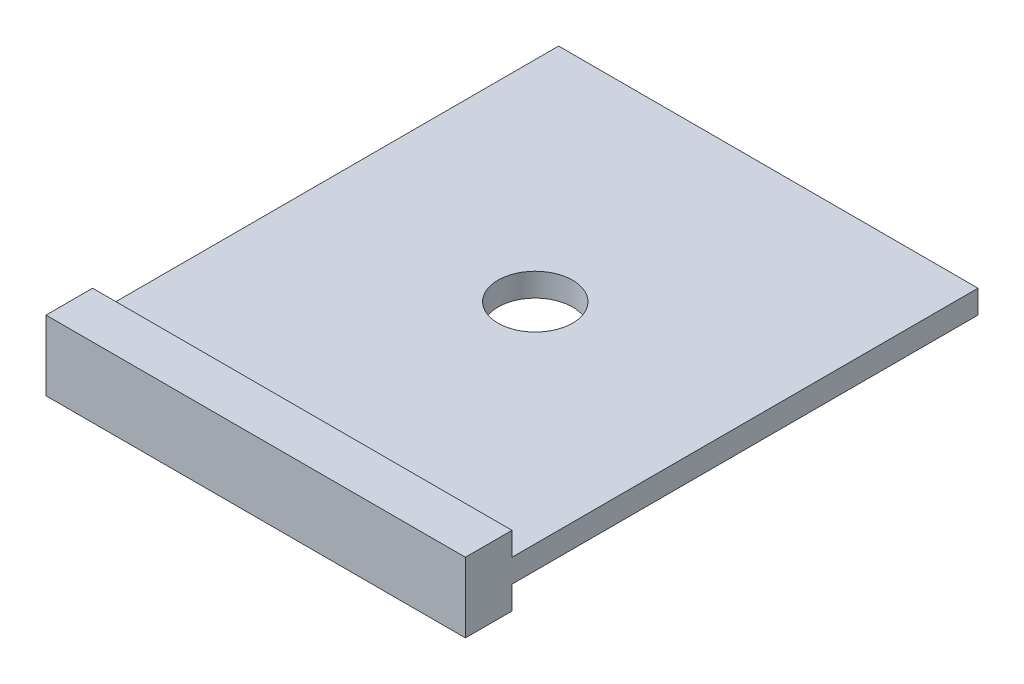
ISO-10303-21;
HEADER;
FILE_DESCRIPTION(('STEP AP214'),'2;1');
FILE_NAME('part.step','',(''),(''),'','','');
FILE_SCHEMA(('AUTOMOTIVE_DESIGN { 1 0 10303 214 1 1 1 1 }'));
ENDSEC;
DATA;
#1=APPLICATION_CONTEXT('core data for automotive mechanical design processes');
#2=APPLICATION_PROTOCOL_DEFINITION('international standard','automotive_design',2000,#1);
#3=PRODUCT_CONTEXT('',#1,'mechanical');
#4=PRODUCT('Part','Part','',(#3));
#5=PRODUCT_RELATED_PRODUCT_CATEGORY('part','',(#4));
#6=PRODUCT_DEFINITION_FORMATION('','',#4);
#7=PRODUCT_DEFINITION_CONTEXT('part definition',#1,'design');
#8=PRODUCT_DEFINITION('design','',#6,#7);
#9=PRODUCT_DEFINITION_SHAPE('','',#8);
#10=(LENGTH_UNIT() NAMED_UNIT(*) SI_UNIT(.MILLI.,.METRE.));
#11=(NAMED_UNIT(*) PLANE_ANGLE_UNIT() SI_UNIT($,.RADIAN.));
#12=(NAMED_UNIT(*) SI_UNIT($,.STERADIAN.) SOLID_ANGLE_UNIT());
#13=UNCERTAINTY_MEASURE_WITH_UNIT(LENGTH_MEASURE(1.E-05),#10,'distance_accuracy_value','');
#14=(GEOMETRIC_REPRESENTATION_CONTEXT(3) GLOBAL_UNCERTAINTY_ASSIGNED_CONTEXT((#13)) GLOBAL_UNIT_ASSIGNED_CONTEXT((#10,
#11,#12)) REPRESENTATION_CONTEXT('',''));
#15=CARTESIAN_POINT('',(0.,0.,0.));
#16=DIRECTION('',(0.,0.,1.));
#17=DIRECTION('',(1.,0.,0.));
#18=AXIS2_PLACEMENT_3D('',#15,#16,#17);
#19=CARTESIAN_POINT('',(18.,1.,0.));
#20=DIRECTION('',(-1.,0.,0.));
#21=DIRECTION('',(0.,0.,1.));
#22=AXIS2_PLACEMENT_3D('',#19,#20,#21);
#23=PLANE('',#22);
#24=DIRECTION('',(0.,0.,-1.));
#25=VECTOR('',#24,1.);
#26=CARTESIAN_POINT('',(18.,0.,0.));
#27=LINE('',#26,#25);
#28=CARTESIAN_POINT('',(18.,0.,0.));
#29=VERTEX_POINT('',#28);
#30=CARTESIAN_POINT('',(18.,0.,-20.));
#31=VERTEX_POINT('',#30);
#32=EDGE_CURVE('E122',#29,#31,#27,.T.);
#33=ORIENTED_EDGE('',*,*,#32,.T.);
#34=DIRECTION('',(0.,-1.,0.));
#35=VECTOR('',#34,1.);
#36=CARTESIAN_POINT('',(18.,1.,-20.));
#37=LINE('',#36,#35);
#38=CARTESIAN_POINT('',(18.,1.,-20.));
#39=VERTEX_POINT('',#38);
#40=EDGE_CURVE('E11',#39,#31,#37,.T.);
#41=ORIENTED_EDGE('',*,*,#40,.F.);
#42=DIRECTION('',(0.,0.,-1.));
#43=VECTOR('',#42,1.);
#44=CARTESIAN_POINT('',(18.,1.,0.));
#45=LINE('',#44,#43);
#46=CARTESIAN_POINT('',(18.,1.,0.));
#47=VERTEX_POINT('',#46);
#48=EDGE_CURVE('E95',#47,#39,#45,.T.);
#49=ORIENTED_EDGE('',*,*,#48,.F.);
#50=DIRECTION('',(0.,1.,0.));
#51=VECTOR('',#50,1.);
#52=CARTESIAN_POINT('',(18.,2.,0.));
#53=LINE('',#52,#51);
#54=CARTESIAN_POINT('',(18.,2.,0.));
#55=VERTEX_POINT('',#54);
#56=EDGE_CURVE('E79',#47,#55,#53,.T.);
#57=ORIENTED_EDGE('',*,*,#56,.T.);
#58=DIRECTION('',(0.,0.,-1.));
#59=VECTOR('',#58,1.);
#60=CARTESIAN_POINT('',(18.,2.,2.));
#61=LINE('',#60,#59);
#62=CARTESIAN_POINT('',(18.,2.,2.));
#63=VERTEX_POINT('',#62);
#64=EDGE_CURVE('E205',#63,#55,#61,.T.);
#65=ORIENTED_EDGE('',*,*,#64,.F.);
#66=DIRECTION('',(0.,1.,0.));
#67=VECTOR('',#66,1.);
#68=CARTESIAN_POINT('',(18.,2.,2.));
#69=LINE('',#68,#67);
#70=CARTESIAN_POINT('',(18.,-1.,2.));
#71=VERTEX_POINT('',#70);
#72=EDGE_CURVE('E188',#71,#63,#69,.T.);
#73=ORIENTED_EDGE('',*,*,#72,.F.);
#74=DIRECTION('',(0.,0.,-1.));
#75=VECTOR('',#74,1.);
#76=CARTESIAN_POINT('',(18.,-1.,2.));
#77=LINE('',#76,#75);
#78=CARTESIAN_POINT('',(18.,-1.,0.));
#79=VERTEX_POINT('',#78);
#80=EDGE_CURVE('E202',#71,#79,#77,.T.);
#81=ORIENTED_EDGE('',*,*,#80,.T.);
#82=EDGE_CURVE('E92',#79,#29,#53,.T.);
#83=ORIENTED_EDGE('',*,*,#82,.T.);
#84=EDGE_LOOP('',(#33,#41,#49,#57,#65,#73,#81,#83));
#85=FACE_BOUND('',#84,.T.);
#86=ADVANCED_FACE('F35',(#85),#23,.F.);
#87=CARTESIAN_POINT('',(0.,1.,-20.));
#88=DIRECTION('',(0.,0.,-1.));
#89=DIRECTION('',(-1.,0.,0.));
#90=AXIS2_PLACEMENT_3D('',#87,#88,#89);
#91=PLANE('',#90);
#92=DIRECTION('',(1.,0.,0.));
#93=VECTOR('',#92,1.);
#94=CARTESIAN_POINT('',(0.,0.,-20.));
#95=LINE('',#94,#93);
#96=CARTESIAN_POINT('',(0.,0.,-20.));
#97=VERTEX_POINT('',#96);
#98=EDGE_CURVE('E106',#97,#31,#95,.T.);
#99=ORIENTED_EDGE('',*,*,#98,.F.);
#100=DIRECTION('',(0.,-1.,0.));
#101=VECTOR('',#100,1.);
#102=CARTESIAN_POINT('',(0.,1.,-20.));
#103=LINE('',#102,#101);
#104=CARTESIAN_POINT('',(0.,1.,-20.));
#105=VERTEX_POINT('',#104);
#106=EDGE_CURVE('E44',#105,#97,#103,.T.);
#107=ORIENTED_EDGE('',*,*,#106,.F.);
#108=DIRECTION('',(1.,0.,0.));
#109=VECTOR('',#108,1.);
#110=CARTESIAN_POINT('',(0.,1.,-20.));
#111=LINE('',#110,#109);
#112=EDGE_CURVE('E97',#105,#39,#111,.T.);
#113=ORIENTED_EDGE('',*,*,#112,.T.);
#114=ORIENTED_EDGE('',*,*,#40,.T.);
#115=EDGE_LOOP('',(#99,#107,#113,#114));
#116=FACE_BOUND('',#115,.T.);
#117=ADVANCED_FACE('F134',(#116),#91,.T.);
#118=CARTESIAN_POINT('',(0.,1.,0.));
#119=DIRECTION('',(-1.,0.,0.));
#120=DIRECTION('',(0.,0.,1.));
#121=AXIS2_PLACEMENT_3D('',#118,#119,#120);
#122=PLANE('',#121);
#123=DIRECTION('',(0.,0.,-1.));
#124=VECTOR('',#123,1.);
#125=CARTESIAN_POINT('',(0.,0.,0.));
#126=LINE('',#125,#124);
#127=CARTESIAN_POINT('',(0.,0.,0.));
#128=VERTEX_POINT('',#127);
#129=EDGE_CURVE('E103',#128,#97,#126,.T.);
#130=ORIENTED_EDGE('',*,*,#129,.F.);
#131=DIRECTION('',(0.,-1.,0.));
#132=VECTOR('',#131,1.);
#133=CARTESIAN_POINT('',(0.,2.,0.));
#134=LINE('',#133,#132);
#135=CARTESIAN_POINT('',(0.,-1.,0.));
#136=VERTEX_POINT('',#135);
#137=EDGE_CURVE('E176',#128,#136,#134,.T.);
#138=ORIENTED_EDGE('',*,*,#137,.T.);
#139=DIRECTION('',(0.,0.,-1.));
#140=VECTOR('',#139,1.);
#141=CARTESIAN_POINT('',(0.,-1.,2.));
#142=LINE('',#141,#140);
#143=CARTESIAN_POINT('',(0.,-1.,2.));
#144=VERTEX_POINT('',#143);
#145=EDGE_CURVE('E123',#144,#136,#142,.T.);
#146=ORIENTED_EDGE('',*,*,#145,.F.);
#147=DIRECTION('',(0.,-1.,0.));
#148=VECTOR('',#147,1.);
#149=CARTESIAN_POINT('',(0.,2.,2.));
#150=LINE('',#149,#148);
#151=CARTESIAN_POINT('',(0.,2.,2.));
#152=VERTEX_POINT('',#151);
#153=EDGE_CURVE('E182',#152,#144,#150,.T.);
#154=ORIENTED_EDGE('',*,*,#153,.F.);
#155=DIRECTION('',(0.,0.,-1.));
#156=VECTOR('',#155,1.);
#157=CARTESIAN_POINT('',(0.,2.,2.));
#158=LINE('',#157,#156);
#159=CARTESIAN_POINT('',(0.,2.,0.));
#160=VERTEX_POINT('',#159);
#161=EDGE_CURVE('E194',#152,#160,#158,.T.);
#162=ORIENTED_EDGE('',*,*,#161,.T.);
#163=CARTESIAN_POINT('',(0.,1.,0.));
#164=VERTEX_POINT('',#163);
#165=EDGE_CURVE('E178',#160,#164,#134,.T.);
#166=ORIENTED_EDGE('',*,*,#165,.T.);
#167=DIRECTION('',(0.,0.,-1.));
#168=VECTOR('',#167,1.);
#169=CARTESIAN_POINT('',(0.,1.,0.));
#170=LINE('',#169,#168);
#171=EDGE_CURVE('E102',#164,#105,#170,.T.);
#172=ORIENTED_EDGE('',*,*,#171,.T.);
#173=ORIENTED_EDGE('',*,*,#106,.T.);
#174=EDGE_LOOP('',(#130,#138,#146,#154,#162,#166,#172,#173));
#175=FACE_BOUND('',#174,.T.);
#176=ADVANCED_FACE('F136',(#175),#122,.T.);
#177=CARTESIAN_POINT('',(0.,1.,0.));
#178=DIRECTION('',(0.,1.,0.));
#179=DIRECTION('',(0.,0.,1.));
#180=AXIS2_PLACEMENT_3D('',#177,#178,#179);
#181=PLANE('',#180);
#182=CARTESIAN_POINT('',(9.,1.,-10.));
#183=DIRECTION('',(0.,1.,0.));
#184=DIRECTION('',(0.,0.,1.));
#185=AXIS2_PLACEMENT_3D('',#182,#183,#184);
#186=CIRCLE('',#185,1.6);
#187=CARTESIAN_POINT('',(9.,1.,-8.4));
#188=VERTEX_POINT('',#187);
#189=EDGE_CURVE('E173',#188,#188,#186,.T.);
#190=ORIENTED_EDGE('',*,*,#189,.F.);
#191=EDGE_LOOP('',(#190));
#192=FACE_BOUND('',#191,.T.);
#193=DIRECTION('',(1.,0.,0.));
#194=VECTOR('',#193,1.);
#195=CARTESIAN_POINT('',(0.,1.,0.));
#196=LINE('',#195,#194);
#197=EDGE_CURVE('E84',#164,#47,#196,.T.);
#198=ORIENTED_EDGE('',*,*,#197,.T.);
#199=ORIENTED_EDGE('',*,*,#48,.T.);
#200=ORIENTED_EDGE('',*,*,#112,.F.);
#201=ORIENTED_EDGE('',*,*,#171,.F.);
#202=EDGE_LOOP('',(#198,#199,#200,#201));
#203=FACE_BOUND('',#202,.T.);
#204=ADVANCED_FACE('F100',(#192,#203),#181,.T.);
#205=CARTESIAN_POINT('',(0.,0.,0.));
#206=DIRECTION('',(0.,1.,0.));
#207=DIRECTION('',(0.,0.,1.));
#208=AXIS2_PLACEMENT_3D('',#205,#206,#207);
#209=PLANE('',#208);
#210=CARTESIAN_POINT('',(9.,0.,-10.));
#211=DIRECTION('',(0.,1.,0.));
#212=DIRECTION('',(0.,0.,1.));
#213=AXIS2_PLACEMENT_3D('',#210,#211,#212);
#214=CIRCLE('',#213,1.6);
#215=CARTESIAN_POINT('',(9.,0.,-8.4));
#216=VERTEX_POINT('',#215);
#217=EDGE_CURVE('E38',#216,#216,#214,.T.);
#218=ORIENTED_EDGE('',*,*,#217,.T.);
#219=EDGE_LOOP('',(#218));
#220=FACE_BOUND('',#219,.T.);
#221=DIRECTION('',(1.,0.,0.));
#222=VECTOR('',#221,1.);
#223=CARTESIAN_POINT('',(0.,0.,0.));
#224=LINE('',#223,#222);
#225=EDGE_CURVE('E69',#128,#29,#224,.T.);
#226=ORIENTED_EDGE('',*,*,#225,.F.);
#227=ORIENTED_EDGE('',*,*,#129,.T.);
#228=ORIENTED_EDGE('',*,*,#98,.T.);
#229=ORIENTED_EDGE('',*,*,#32,.F.);
#230=EDGE_LOOP('',(#226,#227,#228,#229));
#231=FACE_BOUND('',#230,.T.);
#232=ADVANCED_FACE('F132',(#220,#231),#209,.F.);
#233=CARTESIAN_POINT('',(0.,0.,0.));
#234=DIRECTION('',(0.,0.,1.));
#235=DIRECTION('',(1.,0.,0.));
#236=AXIS2_PLACEMENT_3D('',#233,#234,#235);
#237=PLANE('',#236);
#238=ORIENTED_EDGE('',*,*,#137,.F.);
#239=ORIENTED_EDGE('',*,*,#225,.T.);
#240=ORIENTED_EDGE('',*,*,#82,.F.);
#241=DIRECTION('',(1.,0.,0.));
#242=VECTOR('',#241,1.);
#243=CARTESIAN_POINT('',(0.,-1.,0.));
#244=LINE('',#243,#242);
#245=EDGE_CURVE('E93',#136,#79,#244,.T.);
#246=ORIENTED_EDGE('',*,*,#245,.F.);
#247=EDGE_LOOP('',(#238,#239,#240,#246));
#248=FACE_BOUND('',#247,.T.);
#249=ADVANCED_FACE('F146',(#248),#237,.F.);
#250=CARTESIAN_POINT('',(0.,-1.,2.));
#251=DIRECTION('',(0.,1.,0.));
#252=DIRECTION('',(0.,0.,1.));
#253=AXIS2_PLACEMENT_3D('',#250,#251,#252);
#254=PLANE('',#253);
#255=ORIENTED_EDGE('',*,*,#245,.T.);
#256=ORIENTED_EDGE('',*,*,#80,.F.);
#257=DIRECTION('',(1.,0.,0.));
#258=VECTOR('',#257,1.);
#259=CARTESIAN_POINT('',(0.,-1.,2.));
#260=LINE('',#259,#258);
#261=EDGE_CURVE('E185',#144,#71,#260,.T.);
#262=ORIENTED_EDGE('',*,*,#261,.F.);
#263=ORIENTED_EDGE('',*,*,#145,.T.);
#264=EDGE_LOOP('',(#255,#256,#262,#263));
#265=FACE_BOUND('',#264,.T.);
#266=ADVANCED_FACE('F151',(#265),#254,.F.);
#267=CARTESIAN_POINT('',(0.,2.,2.));
#268=DIRECTION('',(0.,-1.,0.));
#269=DIRECTION('',(0.,0.,-1.));
#270=AXIS2_PLACEMENT_3D('',#267,#268,#269);
#271=PLANE('',#270);
#272=DIRECTION('',(-1.,0.,0.));
#273=VECTOR('',#272,1.);
#274=CARTESIAN_POINT('',(0.,2.,0.));
#275=LINE('',#274,#273);
#276=EDGE_CURVE('E88',#55,#160,#275,.T.);
#277=ORIENTED_EDGE('',*,*,#276,.T.);
#278=ORIENTED_EDGE('',*,*,#161,.F.);
#279=DIRECTION('',(-1.,0.,0.));
#280=VECTOR('',#279,1.);
#281=CARTESIAN_POINT('',(0.,2.,2.));
#282=LINE('',#281,#280);
#283=EDGE_CURVE('E191',#63,#152,#282,.T.);
#284=ORIENTED_EDGE('',*,*,#283,.F.);
#285=ORIENTED_EDGE('',*,*,#64,.T.);
#286=EDGE_LOOP('',(#277,#278,#284,#285));
#287=FACE_BOUND('',#286,.T.);
#288=ADVANCED_FACE('F154',(#287),#271,.F.);
#289=CARTESIAN_POINT('',(0.,0.,2.));
#290=DIRECTION('',(0.,0.,1.));
#291=DIRECTION('',(1.,0.,0.));
#292=AXIS2_PLACEMENT_3D('',#289,#290,#291);
#293=PLANE('',#292);
#294=ORIENTED_EDGE('',*,*,#153,.T.);
#295=ORIENTED_EDGE('',*,*,#261,.T.);
#296=ORIENTED_EDGE('',*,*,#72,.T.);
#297=ORIENTED_EDGE('',*,*,#283,.T.);
#298=EDGE_LOOP('',(#294,#295,#296,#297));
#299=FACE_BOUND('',#298,.T.);
#300=ADVANCED_FACE('F158',(#299),#293,.T.);
#301=ORIENTED_EDGE('',*,*,#197,.F.);
#302=ORIENTED_EDGE('',*,*,#165,.F.);
#303=ORIENTED_EDGE('',*,*,#276,.F.);
#304=ORIENTED_EDGE('',*,*,#56,.F.);
#305=EDGE_LOOP('',(#301,#302,#303,#304));
#306=FACE_BOUND('',#305,.T.);
#307=ADVANCED_FACE('F81',(#306),#237,.F.);
#308=CARTESIAN_POINT('',(9.,-1.000025,-10.));
#309=DIRECTION('',(0.,1.,0.));
#310=DIRECTION('',(0.,0.,1.));
#311=AXIS2_PLACEMENT_3D('',#308,#309,#310);
#312=CYLINDRICAL_SURFACE('',#311,1.6);
#313=ORIENTED_EDGE('',*,*,#189,.T.);
#314=EDGE_LOOP('',(#313));
#315=FACE_BOUND('',#314,.T.);
#316=ORIENTED_EDGE('',*,*,#217,.F.);
#317=EDGE_LOOP('',(#316));
#318=FACE_BOUND('',#317,.T.);
#319=ADVANCED_FACE('F162',(#315,#318),#312,.F.);
#320=CLOSED_SHELL('',(#86,#117,#176,#204,#232,#249,#266,#288,#300,#307,#319));
#321=MANIFOLD_SOLID_BREP('B2',#320);
#322=ADVANCED_BREP_SHAPE_REPRESENTATION('',(#18,#321),#14);
#323=SHAPE_DEFINITION_REPRESENTATION(#9,#322);
ENDSEC;
END-ISO-10303-21;
